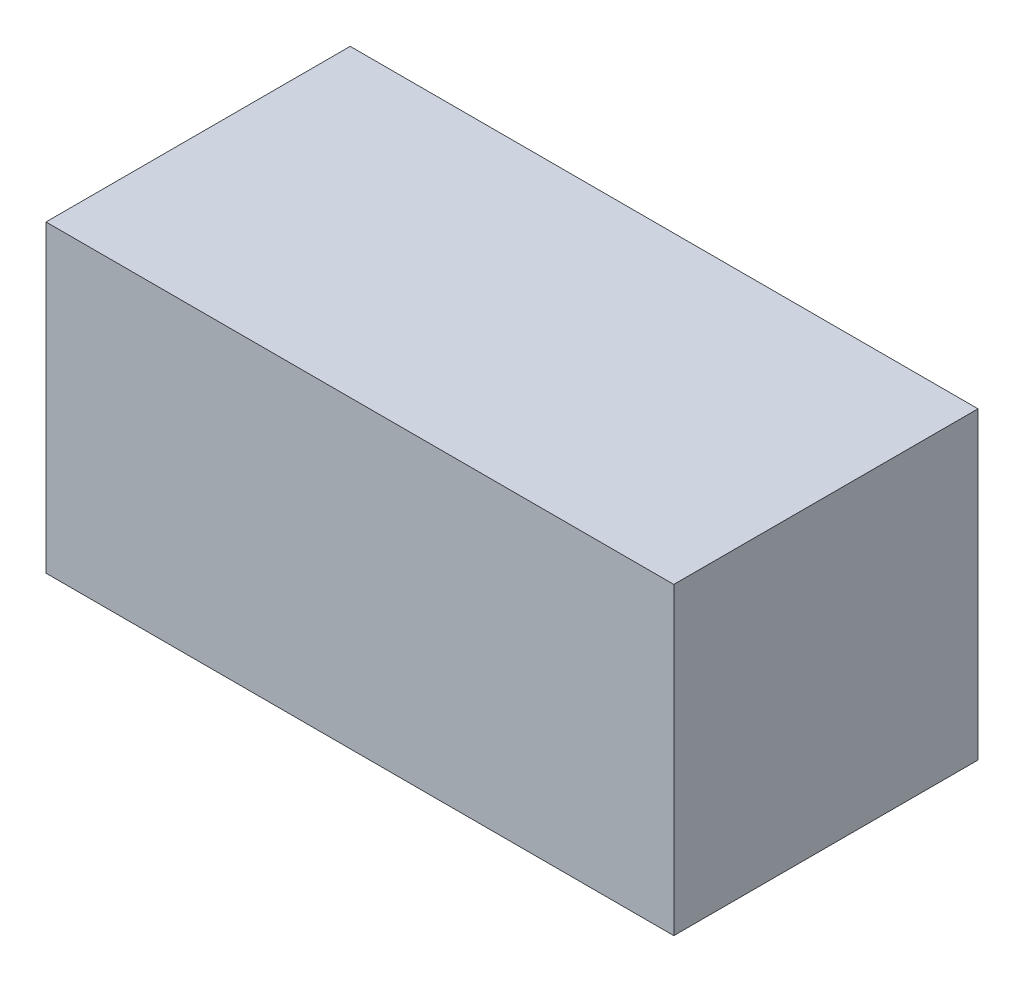
ISO-10303-21;
HEADER;
FILE_DESCRIPTION(('STEP AP214'),'2;1');
FILE_NAME('part.step','',(''),(''),'','','');
FILE_SCHEMA(('AUTOMOTIVE_DESIGN { 1 0 10303 214 1 1 1 1 }'));
ENDSEC;
DATA;
#1=APPLICATION_CONTEXT('core data for automotive mechanical design processes');
#2=APPLICATION_PROTOCOL_DEFINITION('international standard','automotive_design',2000,#1);
#3=PRODUCT_CONTEXT('',#1,'mechanical');
#4=PRODUCT('Part','Part','',(#3));
#5=PRODUCT_RELATED_PRODUCT_CATEGORY('part','',(#4));
#6=PRODUCT_DEFINITION_FORMATION('','',#4);
#7=PRODUCT_DEFINITION_CONTEXT('part definition',#1,'design');
#8=PRODUCT_DEFINITION('design','',#6,#7);
#9=PRODUCT_DEFINITION_SHAPE('','',#8);
#10=(LENGTH_UNIT() NAMED_UNIT(*) SI_UNIT(.MILLI.,.METRE.));
#11=(NAMED_UNIT(*) PLANE_ANGLE_UNIT() SI_UNIT($,.RADIAN.));
#12=(NAMED_UNIT(*) SI_UNIT($,.STERADIAN.) SOLID_ANGLE_UNIT());
#13=UNCERTAINTY_MEASURE_WITH_UNIT(LENGTH_MEASURE(1.E-05),#10,'distance_accuracy_value','');
#14=(GEOMETRIC_REPRESENTATION_CONTEXT(3) GLOBAL_UNCERTAINTY_ASSIGNED_CONTEXT((#13)) GLOBAL_UNIT_ASSIGNED_CONTEXT((#10,
#11,#12)) REPRESENTATION_CONTEXT('',''));
#15=CARTESIAN_POINT('',(0.,0.,0.));
#16=DIRECTION('',(0.,0.,1.));
#17=DIRECTION('',(1.,0.,0.));
#18=AXIS2_PLACEMENT_3D('',#15,#16,#17);
#19=CARTESIAN_POINT('',(-0.485,0.235,0.));
#20=DIRECTION('',(0.,1.,0.));
#21=DIRECTION('',(0.,0.,1.));
#22=AXIS2_PLACEMENT_3D('',#19,#20,#21);
#23=PLANE('',#22);
#24=DIRECTION('',(0.,0.,-1.));
#25=VECTOR('',#24,1.);
#26=CARTESIAN_POINT('',(0.485,0.235,0.));
#27=LINE('',#26,#25);
#28=CARTESIAN_POINT('',(0.485,0.235,0.47));
#29=VERTEX_POINT('',#28);
#30=CARTESIAN_POINT('',(0.485,0.235,0.));
#31=VERTEX_POINT('',#30);
#32=EDGE_CURVE('E11',#29,#31,#27,.T.);
#33=ORIENTED_EDGE('',*,*,#32,.T.);
#34=DIRECTION('',(-1.,0.,0.));
#35=VECTOR('',#34,1.);
#36=CARTESIAN_POINT('',(-0.485,0.235,0.));
#37=LINE('',#36,#35);
#38=CARTESIAN_POINT('',(-0.485,0.235,0.));
#39=VERTEX_POINT('',#38);
#40=EDGE_CURVE('E24',#31,#39,#37,.T.);
#41=ORIENTED_EDGE('',*,*,#40,.T.);
#42=DIRECTION('',(0.,0.,1.));
#43=VECTOR('',#42,1.);
#44=CARTESIAN_POINT('',(-0.485,0.235,0.));
#45=LINE('',#44,#43);
#46=CARTESIAN_POINT('',(-0.485,0.235,0.47));
#47=VERTEX_POINT('',#46);
#48=EDGE_CURVE('E88',#39,#47,#45,.T.);
#49=ORIENTED_EDGE('',*,*,#48,.T.);
#50=DIRECTION('',(1.,0.,0.));
#51=VECTOR('',#50,1.);
#52=CARTESIAN_POINT('',(-0.485,0.235,0.47));
#53=LINE('',#52,#51);
#54=EDGE_CURVE('E60',#47,#29,#53,.T.);
#55=ORIENTED_EDGE('',*,*,#54,.T.);
#56=EDGE_LOOP('',(#33,#41,#49,#55));
#57=FACE_BOUND('',#56,.T.);
#58=ADVANCED_FACE('F17',(#57),#23,.T.);
#59=CARTESIAN_POINT('',(-0.485,0.235,0.));
#60=DIRECTION('',(0.,0.,1.));
#61=DIRECTION('',(1.,0.,0.));
#62=AXIS2_PLACEMENT_3D('',#59,#60,#61);
#63=PLANE('',#62);
#64=DIRECTION('',(0.,1.,0.));
#65=VECTOR('',#64,1.);
#66=CARTESIAN_POINT('',(0.485,0.235,0.));
#67=LINE('',#66,#65);
#68=CARTESIAN_POINT('',(0.485,-0.235,0.));
#69=VERTEX_POINT('',#68);
#70=EDGE_CURVE('E85',#69,#31,#67,.T.);
#71=ORIENTED_EDGE('',*,*,#70,.F.);
#72=DIRECTION('',(1.,0.,0.));
#73=VECTOR('',#72,1.);
#74=CARTESIAN_POINT('',(-0.485,-0.235,0.));
#75=LINE('',#74,#73);
#76=CARTESIAN_POINT('',(-0.485,-0.235,0.));
#77=VERTEX_POINT('',#76);
#78=EDGE_CURVE('E83',#77,#69,#75,.T.);
#79=ORIENTED_EDGE('',*,*,#78,.F.);
#80=DIRECTION('',(0.,-1.,0.));
#81=VECTOR('',#80,1.);
#82=CARTESIAN_POINT('',(-0.485,0.235,0.));
#83=LINE('',#82,#81);
#84=EDGE_CURVE('E77',#39,#77,#83,.T.);
#85=ORIENTED_EDGE('',*,*,#84,.F.);
#86=ORIENTED_EDGE('',*,*,#40,.F.);
#87=EDGE_LOOP('',(#71,#79,#85,#86));
#88=FACE_BOUND('',#87,.T.);
#89=ADVANCED_FACE('F90',(#88),#63,.F.);
#90=CARTESIAN_POINT('',(0.485,0.235,0.));
#91=DIRECTION('',(1.,0.,0.));
#92=DIRECTION('',(0.,0.,-1.));
#93=AXIS2_PLACEMENT_3D('',#90,#91,#92);
#94=PLANE('',#93);
#95=DIRECTION('',(0.,0.,-1.));
#96=VECTOR('',#95,1.);
#97=CARTESIAN_POINT('',(0.485,-0.235,0.));
#98=LINE('',#97,#96);
#99=CARTESIAN_POINT('',(0.485,-0.235,0.47));
#100=VERTEX_POINT('',#99);
#101=EDGE_CURVE('E72',#100,#69,#98,.T.);
#102=ORIENTED_EDGE('',*,*,#101,.T.);
#103=ORIENTED_EDGE('',*,*,#70,.T.);
#104=ORIENTED_EDGE('',*,*,#32,.F.);
#105=DIRECTION('',(0.,-1.,0.));
#106=VECTOR('',#105,1.);
#107=CARTESIAN_POINT('',(0.485,0.235,0.47));
#108=LINE('',#107,#106);
#109=EDGE_CURVE('E64',#29,#100,#108,.T.);
#110=ORIENTED_EDGE('',*,*,#109,.T.);
#111=EDGE_LOOP('',(#102,#103,#104,#110));
#112=FACE_BOUND('',#111,.T.);
#113=ADVANCED_FACE('F91',(#112),#94,.T.);
#114=CARTESIAN_POINT('',(-0.485,0.235,0.47));
#115=DIRECTION('',(0.,0.,1.));
#116=DIRECTION('',(1.,0.,0.));
#117=AXIS2_PLACEMENT_3D('',#114,#115,#116);
#118=PLANE('',#117);
#119=ORIENTED_EDGE('',*,*,#109,.F.);
#120=ORIENTED_EDGE('',*,*,#54,.F.);
#121=DIRECTION('',(0.,-1.,0.));
#122=VECTOR('',#121,1.);
#123=CARTESIAN_POINT('',(-0.485,0.235,0.47));
#124=LINE('',#123,#122);
#125=CARTESIAN_POINT('',(-0.485,-0.235,0.47));
#126=VERTEX_POINT('',#125);
#127=EDGE_CURVE('E55',#47,#126,#124,.T.);
#128=ORIENTED_EDGE('',*,*,#127,.T.);
#129=DIRECTION('',(1.,0.,0.));
#130=VECTOR('',#129,1.);
#131=CARTESIAN_POINT('',(-0.485,-0.235,0.47));
#132=LINE('',#131,#130);
#133=EDGE_CURVE('E59',#126,#100,#132,.T.);
#134=ORIENTED_EDGE('',*,*,#133,.T.);
#135=EDGE_LOOP('',(#119,#120,#128,#134));
#136=FACE_BOUND('',#135,.T.);
#137=ADVANCED_FACE('F58',(#136),#118,.T.);
#138=CARTESIAN_POINT('',(-0.485,-0.235,0.));
#139=DIRECTION('',(-1.,0.,0.));
#140=DIRECTION('',(0.,0.,1.));
#141=AXIS2_PLACEMENT_3D('',#138,#139,#140);
#142=PLANE('',#141);
#143=ORIENTED_EDGE('',*,*,#48,.F.);
#144=ORIENTED_EDGE('',*,*,#84,.T.);
#145=DIRECTION('',(0.,0.,1.));
#146=VECTOR('',#145,1.);
#147=CARTESIAN_POINT('',(-0.485,-0.235,0.));
#148=LINE('',#147,#146);
#149=EDGE_CURVE('E70',#77,#126,#148,.T.);
#150=ORIENTED_EDGE('',*,*,#149,.T.);
#151=ORIENTED_EDGE('',*,*,#127,.F.);
#152=EDGE_LOOP('',(#143,#144,#150,#151));
#153=FACE_BOUND('',#152,.T.);
#154=ADVANCED_FACE('F75',(#153),#142,.T.);
#155=CARTESIAN_POINT('',(0.485,-0.235,0.));
#156=DIRECTION('',(0.,-1.,0.));
#157=DIRECTION('',(0.,0.,-1.));
#158=AXIS2_PLACEMENT_3D('',#155,#156,#157);
#159=PLANE('',#158);
#160=ORIENTED_EDGE('',*,*,#149,.F.);
#161=ORIENTED_EDGE('',*,*,#78,.T.);
#162=ORIENTED_EDGE('',*,*,#101,.F.);
#163=ORIENTED_EDGE('',*,*,#133,.F.);
#164=EDGE_LOOP('',(#160,#161,#162,#163));
#165=FACE_BOUND('',#164,.T.);
#166=ADVANCED_FACE('F68',(#165),#159,.T.);
#167=CLOSED_SHELL('',(#58,#89,#113,#137,#154,#166));
#168=MANIFOLD_SOLID_BREP('B1',#167);
#169=ADVANCED_BREP_SHAPE_REPRESENTATION('',(#18,#168),#14);
#170=SHAPE_DEFINITION_REPRESENTATION(#9,#169);
ENDSEC;
END-ISO-10303-21;
